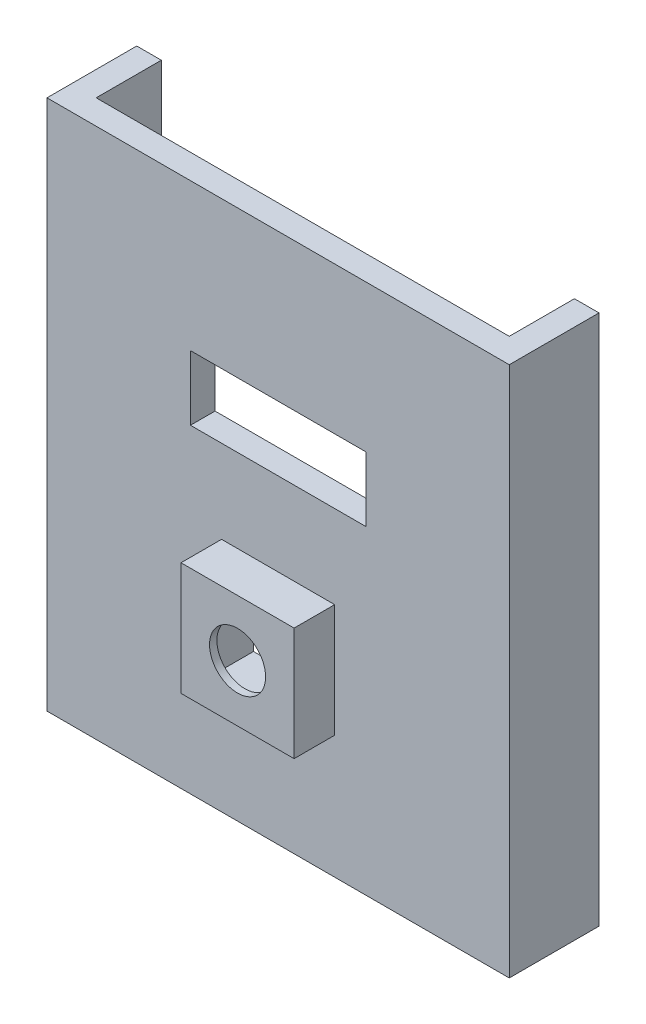
ISO-10303-21;
HEADER;
FILE_DESCRIPTION(('STEP AP214'),'2;1');
FILE_NAME('part.step','',(''),(''),'','','');
FILE_SCHEMA(('AUTOMOTIVE_DESIGN { 1 0 10303 214 1 1 1 1 }'));
ENDSEC;
DATA;
#1=APPLICATION_CONTEXT('core data for automotive mechanical design processes');
#2=APPLICATION_PROTOCOL_DEFINITION('international standard','automotive_design',2000,#1);
#3=PRODUCT_CONTEXT('',#1,'mechanical');
#4=PRODUCT('Part','Part','',(#3));
#5=PRODUCT_RELATED_PRODUCT_CATEGORY('part','',(#4));
#6=PRODUCT_DEFINITION_FORMATION('','',#4);
#7=PRODUCT_DEFINITION_CONTEXT('part definition',#1,'design');
#8=PRODUCT_DEFINITION('design','',#6,#7);
#9=PRODUCT_DEFINITION_SHAPE('','',#8);
#10=(LENGTH_UNIT() NAMED_UNIT(*) SI_UNIT(.MILLI.,.METRE.));
#11=(NAMED_UNIT(*) PLANE_ANGLE_UNIT() SI_UNIT($,.RADIAN.));
#12=(NAMED_UNIT(*) SI_UNIT($,.STERADIAN.) SOLID_ANGLE_UNIT());
#13=UNCERTAINTY_MEASURE_WITH_UNIT(LENGTH_MEASURE(1.E-05),#10,'distance_accuracy_value','');
#14=(GEOMETRIC_REPRESENTATION_CONTEXT(3) GLOBAL_UNCERTAINTY_ASSIGNED_CONTEXT((#13)) GLOBAL_UNIT_ASSIGNED_CONTEXT((#10,
#11,#12)) REPRESENTATION_CONTEXT('',''));
#15=CARTESIAN_POINT('',(0.,0.,0.));
#16=DIRECTION('',(0.,0.,1.));
#17=DIRECTION('',(1.,0.,0.));
#18=AXIS2_PLACEMENT_3D('',#15,#16,#17);
#19=CARTESIAN_POINT('',(-93.9999999999997,-103.,103.));
#20=DIRECTION('',(1.,0.,0.));
#21=DIRECTION('',(0.,0.,-1.));
#22=AXIS2_PLACEMENT_3D('',#19,#20,#21);
#23=PLANE('',#22);
#24=DIRECTION('',(0.,1.,0.));
#25=VECTOR('',#24,1.);
#26=CARTESIAN_POINT('',(-93.9999999999997,0.,86.5));
#27=LINE('',#26,#25);
#28=CARTESIAN_POINT('',(-93.9999999999997,-72.9999999999995,86.5));
#29=VERTEX_POINT('',#28);
#30=CARTESIAN_POINT('',(-93.9999999999997,-52.9999999999995,86.5));
#31=VERTEX_POINT('',#30);
#32=EDGE_CURVE('E57',#29,#31,#27,.T.);
#33=ORIENTED_EDGE('',*,*,#32,.F.);
#34=DIRECTION('',(0.,0.,-1.));
#35=VECTOR('',#34,1.);
#36=CARTESIAN_POINT('',(-93.9999999999997,-72.9999999999995,0.));
#37=LINE('',#36,#35);
#38=CARTESIAN_POINT('',(-93.9999999999997,-72.9999999999995,76.5));
#39=VERTEX_POINT('',#38);
#40=EDGE_CURVE('E243',#29,#39,#37,.T.);
#41=ORIENTED_EDGE('',*,*,#40,.T.);
#42=DIRECTION('',(0.,1.,0.));
#43=VECTOR('',#42,1.);
#44=CARTESIAN_POINT('',(-93.9999999999997,-103.,76.5));
#45=LINE('',#44,#43);
#46=CARTESIAN_POINT('',(-93.9999999999997,-113.,76.5));
#47=VERTEX_POINT('',#46);
#48=EDGE_CURVE('E420',#47,#39,#45,.T.);
#49=ORIENTED_EDGE('',*,*,#48,.F.);
#50=DIRECTION('',(0.,0.,-1.));
#51=VECTOR('',#50,1.);
#52=CARTESIAN_POINT('',(-93.9999999999997,-113.,103.));
#53=LINE('',#52,#51);
#54=CARTESIAN_POINT('',(-93.9999999999997,-113.,113.));
#55=VERTEX_POINT('',#54);
#56=EDGE_CURVE('E432',#55,#47,#53,.T.);
#57=ORIENTED_EDGE('',*,*,#56,.F.);
#58=DIRECTION('',(0.,-1.,0.));
#59=VECTOR('',#58,1.);
#60=CARTESIAN_POINT('',(-93.9999999999997,0.,113.));
#61=LINE('',#60,#59);
#62=CARTESIAN_POINT('',(-93.9999999999997,103.,113.));
#63=VERTEX_POINT('',#62);
#64=EDGE_CURVE('E292',#63,#55,#61,.T.);
#65=ORIENTED_EDGE('',*,*,#64,.F.);
#66=DIRECTION('',(0.,0.,-1.));
#67=VECTOR('',#66,1.);
#68=CARTESIAN_POINT('',(-93.9999999999997,103.,103.));
#69=LINE('',#68,#67);
#70=CARTESIAN_POINT('',(-93.9999999999997,103.,76.5));
#71=VERTEX_POINT('',#70);
#72=EDGE_CURVE('E429',#63,#71,#69,.T.);
#73=ORIENTED_EDGE('',*,*,#72,.T.);
#74=CARTESIAN_POINT('',(-93.9999999999997,63.0000000000004,76.5));
#75=VERTEX_POINT('',#74);
#76=EDGE_CURVE('E424',#75,#71,#45,.T.);
#77=ORIENTED_EDGE('',*,*,#76,.F.);
#78=DIRECTION('',(0.,0.,1.));
#79=VECTOR('',#78,1.);
#80=CARTESIAN_POINT('',(-93.9999999999997,63.0000000000004,0.));
#81=LINE('',#80,#79);
#82=CARTESIAN_POINT('',(-93.9999999999997,63.0000000000004,86.5));
#83=VERTEX_POINT('',#82);
#84=EDGE_CURVE('E256',#75,#83,#81,.T.);
#85=ORIENTED_EDGE('',*,*,#84,.T.);
#86=DIRECTION('',(0.,1.,0.));
#87=VECTOR('',#86,1.);
#88=CARTESIAN_POINT('',(-93.9999999999997,0.,86.5));
#89=LINE('',#88,#87);
#90=CARTESIAN_POINT('',(-93.9999999999997,43.0000000000004,86.5));
#91=VERTEX_POINT('',#90);
#92=EDGE_CURVE('E262',#91,#83,#89,.T.);
#93=ORIENTED_EDGE('',*,*,#92,.F.);
#94=DIRECTION('',(0.,0.,1.));
#95=VECTOR('',#94,1.);
#96=CARTESIAN_POINT('',(-93.9999999999997,43.0000000000004,0.));
#97=LINE('',#96,#95);
#98=CARTESIAN_POINT('',(-93.9999999999997,43.0000000000004,76.5));
#99=VERTEX_POINT('',#98);
#100=EDGE_CURVE('E269',#99,#91,#97,.T.);
#101=ORIENTED_EDGE('',*,*,#100,.F.);
#102=CARTESIAN_POINT('',(-93.9999999999997,-52.9999999999995,76.5));
#103=VERTEX_POINT('',#102);
#104=EDGE_CURVE('E63',#103,#99,#45,.T.);
#105=ORIENTED_EDGE('',*,*,#104,.F.);
#106=DIRECTION('',(0.,0.,-1.));
#107=VECTOR('',#106,1.);
#108=CARTESIAN_POINT('',(-93.9999999999997,-52.9999999999995,0.));
#109=LINE('',#108,#107);
#110=EDGE_CURVE('E482',#31,#103,#109,.T.);
#111=ORIENTED_EDGE('',*,*,#110,.F.);
#112=EDGE_LOOP('',(#33,#41,#49,#57,#65,#73,#77,#85,#93,#101,#105,#111));
#113=FACE_BOUND('',#112,.T.);
#114=ADVANCED_FACE('F40',(#113),#23,.F.);
#115=CARTESIAN_POINT('',(-93.9999999999997,103.,76.5));
#116=DIRECTION('',(0.,0.,-1.));
#117=DIRECTION('',(-1.,0.,0.));
#118=AXIS2_PLACEMENT_3D('',#115,#116,#117);
#119=PLANE('',#118);
#120=DIRECTION('',(0.,-1.,0.));
#121=VECTOR('',#120,1.);
#122=CARTESIAN_POINT('',(84.0000000000003,-103.,76.5));
#123=LINE('',#122,#121);
#124=CARTESIAN_POINT('',(84.0000000000003,103.,76.5));
#125=VERTEX_POINT('',#124);
#126=CARTESIAN_POINT('',(84.0000000000003,-103.,76.5));
#127=VERTEX_POINT('',#126);
#128=EDGE_CURVE('E408',#125,#127,#123,.T.);
#129=ORIENTED_EDGE('',*,*,#128,.F.);
#130=DIRECTION('',(1.,0.,0.));
#131=VECTOR('',#130,1.);
#132=CARTESIAN_POINT('',(-83.9999999999998,103.,76.5));
#133=LINE('',#132,#131);
#134=CARTESIAN_POINT('',(94.0000000000002,103.,76.5));
#135=VERTEX_POINT('',#134);
#136=EDGE_CURVE('E412',#125,#135,#133,.T.);
#137=ORIENTED_EDGE('',*,*,#136,.T.);
#138=DIRECTION('',(0.,-1.,0.));
#139=VECTOR('',#138,1.);
#140=CARTESIAN_POINT('',(94.0000000000003,-103.,76.5));
#141=LINE('',#140,#139);
#142=CARTESIAN_POINT('',(94.0000000000003,-113.,76.5));
#143=VERTEX_POINT('',#142);
#144=EDGE_CURVE('E416',#135,#143,#141,.T.);
#145=ORIENTED_EDGE('',*,*,#144,.T.);
#146=DIRECTION('',(-1.,0.,0.));
#147=VECTOR('',#146,1.);
#148=CARTESIAN_POINT('',(-83.9999999999998,-113.,76.5));
#149=LINE('',#148,#147);
#150=EDGE_CURVE('E283',#143,#47,#149,.T.);
#151=ORIENTED_EDGE('',*,*,#150,.T.);
#152=ORIENTED_EDGE('',*,*,#48,.T.);
#153=DIRECTION('',(-1.,0.,0.));
#154=VECTOR('',#153,1.);
#155=CARTESIAN_POINT('',(-114.,-72.9999999999995,76.5));
#156=LINE('',#155,#154);
#157=CARTESIAN_POINT('',(-114.,-72.9999999999995,76.5));
#158=VERTEX_POINT('',#157);
#159=EDGE_CURVE('E248',#39,#158,#156,.T.);
#160=ORIENTED_EDGE('',*,*,#159,.T.);
#161=DIRECTION('',(0.,1.,0.));
#162=VECTOR('',#161,1.);
#163=CARTESIAN_POINT('',(-114.,0.,76.5));
#164=LINE('',#163,#162);
#165=CARTESIAN_POINT('',(-114.,-52.9999999999995,76.5));
#166=VERTEX_POINT('',#165);
#167=EDGE_CURVE('E253',#158,#166,#164,.T.);
#168=ORIENTED_EDGE('',*,*,#167,.T.);
#169=DIRECTION('',(-1.,0.,0.));
#170=VECTOR('',#169,1.);
#171=CARTESIAN_POINT('',(-114.,-52.9999999999995,76.5));
#172=LINE('',#171,#170);
#173=EDGE_CURVE('E232',#103,#166,#172,.T.);
#174=ORIENTED_EDGE('',*,*,#173,.F.);
#175=ORIENTED_EDGE('',*,*,#104,.T.);
#176=DIRECTION('',(1.,0.,0.));
#177=VECTOR('',#176,1.);
#178=CARTESIAN_POINT('',(-114.,43.0000000000004,76.5));
#179=LINE('',#178,#177);
#180=CARTESIAN_POINT('',(-114.,43.0000000000004,76.5));
#181=VERTEX_POINT('',#180);
#182=EDGE_CURVE('E279',#181,#99,#179,.T.);
#183=ORIENTED_EDGE('',*,*,#182,.F.);
#184=DIRECTION('',(0.,1.,0.));
#185=VECTOR('',#184,1.);
#186=CARTESIAN_POINT('',(-114.,0.,76.5));
#187=LINE('',#186,#185);
#188=CARTESIAN_POINT('',(-114.,63.0000000000004,76.5));
#189=VERTEX_POINT('',#188);
#190=EDGE_CURVE('E280',#181,#189,#187,.T.);
#191=ORIENTED_EDGE('',*,*,#190,.T.);
#192=DIRECTION('',(1.,0.,0.));
#193=VECTOR('',#192,1.);
#194=CARTESIAN_POINT('',(-114.,63.0000000000004,76.5));
#195=LINE('',#194,#193);
#196=EDGE_CURVE('E284',#189,#75,#195,.T.);
#197=ORIENTED_EDGE('',*,*,#196,.T.);
#198=ORIENTED_EDGE('',*,*,#76,.T.);
#199=CARTESIAN_POINT('',(-83.9999999999998,103.,76.5));
#200=VERTEX_POINT('',#199);
#201=EDGE_CURVE('E411',#71,#200,#133,.T.);
#202=ORIENTED_EDGE('',*,*,#201,.T.);
#203=DIRECTION('',(0.,1.,0.));
#204=VECTOR('',#203,1.);
#205=CARTESIAN_POINT('',(-83.9999999999998,-103.,76.5));
#206=LINE('',#205,#204);
#207=CARTESIAN_POINT('',(-83.9999999999998,-103.,76.5));
#208=VERTEX_POINT('',#207);
#209=EDGE_CURVE('E406',#208,#200,#206,.T.);
#210=ORIENTED_EDGE('',*,*,#209,.F.);
#211=DIRECTION('',(-1.,0.,0.));
#212=VECTOR('',#211,1.);
#213=CARTESIAN_POINT('',(-83.9999999999998,-103.,76.5));
#214=LINE('',#213,#212);
#215=EDGE_CURVE('E403',#127,#208,#214,.T.);
#216=ORIENTED_EDGE('',*,*,#215,.F.);
#217=EDGE_LOOP('',(#129,#137,#145,#151,#152,#160,#168,#174,#175,#183,#191,#197,#198,#202,#210,#216));
#218=FACE_BOUND('',#217,.T.);
#219=ADVANCED_FACE('F464',(#218),#119,.T.);
#220=CARTESIAN_POINT('',(0.,-40.,106.5));
#221=DIRECTION('',(0.,0.,1.));
#222=DIRECTION('',(1.,0.,0.));
#223=AXIS2_PLACEMENT_3D('',#220,#221,#222);
#224=CYLINDRICAL_SURFACE('',#223,11.4);
#225=CARTESIAN_POINT('',(0.,-40.,126.5));
#226=DIRECTION('',(0.,0.,-1.));
#227=DIRECTION('',(-1.,0.,0.));
#228=AXIS2_PLACEMENT_3D('',#225,#226,#227);
#229=CIRCLE('',#228,11.4);
#230=CARTESIAN_POINT('',(-11.4,-40.,126.5));
#231=VERTEX_POINT('',#230);
#232=EDGE_CURVE('E389',#231,#231,#229,.T.);
#233=ORIENTED_EDGE('',*,*,#232,.T.);
#234=EDGE_LOOP('',(#233));
#235=FACE_BOUND('',#234,.T.);
#236=CARTESIAN_POINT('',(0.,-40.,129.5));
#237=DIRECTION('',(0.,0.,1.));
#238=DIRECTION('',(1.,0.,0.));
#239=AXIS2_PLACEMENT_3D('',#236,#237,#238);
#240=CIRCLE('',#239,11.4);
#241=CARTESIAN_POINT('',(11.4,-40.,129.5));
#242=VERTEX_POINT('',#241);
#243=EDGE_CURVE('E392',#242,#242,#240,.T.);
#244=ORIENTED_EDGE('',*,*,#243,.T.);
#245=EDGE_LOOP('',(#244));
#246=FACE_BOUND('',#245,.T.);
#247=ADVANCED_FACE('F485',(#235,#246),#224,.F.);
#248=CARTESIAN_POINT('',(0.,0.,129.5));
#249=DIRECTION('',(0.,0.,-1.));
#250=DIRECTION('',(-1.,0.,0.));
#251=AXIS2_PLACEMENT_3D('',#248,#249,#250);
#252=PLANE('',#251);
#253=ORIENTED_EDGE('',*,*,#243,.F.);
#254=EDGE_LOOP('',(#253));
#255=FACE_BOUND('',#254,.T.);
#256=DIRECTION('',(0.,1.,0.));
#257=VECTOR('',#256,1.);
#258=CARTESIAN_POINT('',(-23.,0.,129.5));
#259=LINE('',#258,#257);
#260=CARTESIAN_POINT('',(-23.,-63.,129.5));
#261=VERTEX_POINT('',#260);
#262=CARTESIAN_POINT('',(-23.,-17.,129.5));
#263=VERTEX_POINT('',#262);
#264=EDGE_CURVE('E355',#261,#263,#259,.T.);
#265=ORIENTED_EDGE('',*,*,#264,.F.);
#266=DIRECTION('',(1.,0.,0.));
#267=VECTOR('',#266,1.);
#268=CARTESIAN_POINT('',(0.,-63.,129.5));
#269=LINE('',#268,#267);
#270=CARTESIAN_POINT('',(23.,-63.,129.5));
#271=VERTEX_POINT('',#270);
#272=EDGE_CURVE('E344',#261,#271,#269,.T.);
#273=ORIENTED_EDGE('',*,*,#272,.T.);
#274=DIRECTION('',(0.,1.,0.));
#275=VECTOR('',#274,1.);
#276=CARTESIAN_POINT('',(23.,0.,129.5));
#277=LINE('',#276,#275);
#278=CARTESIAN_POINT('',(23.,-17.,129.5));
#279=VERTEX_POINT('',#278);
#280=EDGE_CURVE('E365',#271,#279,#277,.T.);
#281=ORIENTED_EDGE('',*,*,#280,.T.);
#282=DIRECTION('',(1.,0.,0.));
#283=VECTOR('',#282,1.);
#284=CARTESIAN_POINT('',(0.,-17.,129.5));
#285=LINE('',#284,#283);
#286=EDGE_CURVE('E367',#263,#279,#285,.T.);
#287=ORIENTED_EDGE('',*,*,#286,.F.);
#288=EDGE_LOOP('',(#265,#273,#281,#287));
#289=FACE_BOUND('',#288,.T.);
#290=ADVANCED_FACE('F494',(#255,#289),#252,.F.);
#291=CARTESIAN_POINT('',(0.,0.,126.5));
#292=DIRECTION('',(0.,0.,-1.));
#293=DIRECTION('',(-1.,0.,0.));
#294=AXIS2_PLACEMENT_3D('',#291,#292,#293);
#295=PLANE('',#294);
#296=ORIENTED_EDGE('',*,*,#232,.F.);
#297=EDGE_LOOP('',(#296));
#298=FACE_BOUND('',#297,.T.);
#299=DIRECTION('',(0.,1.,0.));
#300=VECTOR('',#299,1.);
#301=CARTESIAN_POINT('',(-20.,-60.,126.5));
#302=LINE('',#301,#300);
#303=CARTESIAN_POINT('',(-20.,-60.,126.5));
#304=VERTEX_POINT('',#303);
#305=CARTESIAN_POINT('',(-20.,-20.,126.5));
#306=VERTEX_POINT('',#305);
#307=EDGE_CURVE('E386',#304,#306,#302,.T.);
#308=ORIENTED_EDGE('',*,*,#307,.T.);
#309=DIRECTION('',(1.,0.,0.));
#310=VECTOR('',#309,1.);
#311=CARTESIAN_POINT('',(-20.,-20.,126.5));
#312=LINE('',#311,#310);
#313=CARTESIAN_POINT('',(20.,-20.,126.5));
#314=VERTEX_POINT('',#313);
#315=EDGE_CURVE('E383',#306,#314,#312,.T.);
#316=ORIENTED_EDGE('',*,*,#315,.T.);
#317=DIRECTION('',(0.,1.,0.));
#318=VECTOR('',#317,1.);
#319=CARTESIAN_POINT('',(20.,-60.,126.5));
#320=LINE('',#319,#318);
#321=CARTESIAN_POINT('',(20.,-60.,126.5));
#322=VERTEX_POINT('',#321);
#323=EDGE_CURVE('E381',#322,#314,#320,.T.);
#324=ORIENTED_EDGE('',*,*,#323,.F.);
#325=DIRECTION('',(1.,0.,0.));
#326=VECTOR('',#325,1.);
#327=CARTESIAN_POINT('',(-20.,-60.,126.5));
#328=LINE('',#327,#326);
#329=EDGE_CURVE('E374',#304,#322,#328,.T.);
#330=ORIENTED_EDGE('',*,*,#329,.F.);
#331=EDGE_LOOP('',(#308,#316,#324,#330));
#332=FACE_BOUND('',#331,.T.);
#333=ADVANCED_FACE('F500',(#298,#332),#295,.T.);
#334=CARTESIAN_POINT('',(23.,0.,129.5));
#335=DIRECTION('',(-1.,0.,0.));
#336=DIRECTION('',(0.,0.,1.));
#337=AXIS2_PLACEMENT_3D('',#334,#335,#336);
#338=PLANE('',#337);
#339=DIRECTION('',(0.,1.,0.));
#340=VECTOR('',#339,1.);
#341=CARTESIAN_POINT('',(23.,0.,113.));
#342=LINE('',#341,#340);
#343=CARTESIAN_POINT('',(23.,-63.,113.));
#344=VERTEX_POINT('',#343);
#345=CARTESIAN_POINT('',(23.,-17.,113.));
#346=VERTEX_POINT('',#345);
#347=EDGE_CURVE('E354',#344,#346,#342,.T.);
#348=ORIENTED_EDGE('',*,*,#347,.T.);
#349=DIRECTION('',(0.,0.,-1.));
#350=VECTOR('',#349,1.);
#351=CARTESIAN_POINT('',(23.,-17.,129.5));
#352=LINE('',#351,#350);
#353=EDGE_CURVE('E345',#279,#346,#352,.T.);
#354=ORIENTED_EDGE('',*,*,#353,.F.);
#355=ORIENTED_EDGE('',*,*,#280,.F.);
#356=DIRECTION('',(0.,0.,-1.));
#357=VECTOR('',#356,1.);
#358=CARTESIAN_POINT('',(23.,-63.,129.5));
#359=LINE('',#358,#357);
#360=EDGE_CURVE('E348',#271,#344,#359,.T.);
#361=ORIENTED_EDGE('',*,*,#360,.T.);
#362=EDGE_LOOP('',(#348,#354,#355,#361));
#363=FACE_BOUND('',#362,.T.);
#364=ADVANCED_FACE('F555',(#363),#338,.F.);
#365=CARTESIAN_POINT('',(0.,-17.,129.5));
#366=DIRECTION('',(0.,1.,0.));
#367=DIRECTION('',(0.,0.,1.));
#368=AXIS2_PLACEMENT_3D('',#365,#366,#367);
#369=PLANE('',#368);
#370=DIRECTION('',(1.,0.,0.));
#371=VECTOR('',#370,1.);
#372=CARTESIAN_POINT('',(0.,-17.,113.));
#373=LINE('',#372,#371);
#374=CARTESIAN_POINT('',(-23.,-17.,113.));
#375=VERTEX_POINT('',#374);
#376=EDGE_CURVE('E357',#375,#346,#373,.T.);
#377=ORIENTED_EDGE('',*,*,#376,.F.);
#378=DIRECTION('',(0.,0.,-1.));
#379=VECTOR('',#378,1.);
#380=CARTESIAN_POINT('',(-23.,-17.,129.5));
#381=LINE('',#380,#379);
#382=EDGE_CURVE('E342',#263,#375,#381,.T.);
#383=ORIENTED_EDGE('',*,*,#382,.F.);
#384=ORIENTED_EDGE('',*,*,#286,.T.);
#385=ORIENTED_EDGE('',*,*,#353,.T.);
#386=EDGE_LOOP('',(#377,#383,#384,#385));
#387=FACE_BOUND('',#386,.T.);
#388=ADVANCED_FACE('F551',(#387),#369,.T.);
#389=CARTESIAN_POINT('',(-23.,0.,129.5));
#390=DIRECTION('',(-1.,0.,0.));
#391=DIRECTION('',(0.,0.,1.));
#392=AXIS2_PLACEMENT_3D('',#389,#390,#391);
#393=PLANE('',#392);
#394=DIRECTION('',(0.,1.,0.));
#395=VECTOR('',#394,1.);
#396=CARTESIAN_POINT('',(-23.,0.,113.));
#397=LINE('',#396,#395);
#398=CARTESIAN_POINT('',(-23.,-63.,113.));
#399=VERTEX_POINT('',#398);
#400=EDGE_CURVE('E360',#399,#375,#397,.T.);
#401=ORIENTED_EDGE('',*,*,#400,.F.);
#402=DIRECTION('',(0.,0.,-1.));
#403=VECTOR('',#402,1.);
#404=CARTESIAN_POINT('',(-23.,-63.,129.5));
#405=LINE('',#404,#403);
#406=EDGE_CURVE('E330',#261,#399,#405,.T.);
#407=ORIENTED_EDGE('',*,*,#406,.F.);
#408=ORIENTED_EDGE('',*,*,#264,.T.);
#409=ORIENTED_EDGE('',*,*,#382,.T.);
#410=EDGE_LOOP('',(#401,#407,#408,#409));
#411=FACE_BOUND('',#410,.T.);
#412=ADVANCED_FACE('F547',(#411),#393,.T.);
#413=CARTESIAN_POINT('',(0.,-63.,129.5));
#414=DIRECTION('',(0.,1.,0.));
#415=DIRECTION('',(0.,0.,1.));
#416=AXIS2_PLACEMENT_3D('',#413,#414,#415);
#417=PLANE('',#416);
#418=DIRECTION('',(1.,0.,0.));
#419=VECTOR('',#418,1.);
#420=CARTESIAN_POINT('',(0.,-63.,113.));
#421=LINE('',#420,#419);
#422=EDGE_CURVE('E352',#399,#344,#421,.T.);
#423=ORIENTED_EDGE('',*,*,#422,.T.);
#424=ORIENTED_EDGE('',*,*,#360,.F.);
#425=ORIENTED_EDGE('',*,*,#272,.F.);
#426=ORIENTED_EDGE('',*,*,#406,.T.);
#427=EDGE_LOOP('',(#423,#424,#425,#426));
#428=FACE_BOUND('',#427,.T.);
#429=ADVANCED_FACE('F550',(#428),#417,.F.);
#430=CARTESIAN_POINT('',(-20.,-20.,126.5));
#431=DIRECTION('',(0.,1.,0.));
#432=DIRECTION('',(0.,0.,1.));
#433=AXIS2_PLACEMENT_3D('',#430,#431,#432);
#434=PLANE('',#433);
#435=DIRECTION('',(0.,0.,-1.));
#436=VECTOR('',#435,1.);
#437=CARTESIAN_POINT('',(-20.,-20.,126.5));
#438=LINE('',#437,#436);
#439=CARTESIAN_POINT('',(-20.,-20.,103.));
#440=VERTEX_POINT('',#439);
#441=EDGE_CURVE('E372',#306,#440,#438,.T.);
#442=ORIENTED_EDGE('',*,*,#441,.T.);
#443=DIRECTION('',(-1.,0.,0.));
#444=VECTOR('',#443,1.);
#445=CARTESIAN_POINT('',(-20.,-20.,103.));
#446=LINE('',#445,#444);
#447=CARTESIAN_POINT('',(20.,-20.,103.));
#448=VERTEX_POINT('',#447);
#449=EDGE_CURVE('E11',#448,#440,#446,.T.);
#450=ORIENTED_EDGE('',*,*,#449,.F.);
#451=DIRECTION('',(0.,0.,-1.));
#452=VECTOR('',#451,1.);
#453=CARTESIAN_POINT('',(20.,-20.,126.5));
#454=LINE('',#453,#452);
#455=EDGE_CURVE('E375',#314,#448,#454,.T.);
#456=ORIENTED_EDGE('',*,*,#455,.F.);
#457=ORIENTED_EDGE('',*,*,#315,.F.);
#458=EDGE_LOOP('',(#442,#450,#456,#457));
#459=FACE_BOUND('',#458,.T.);
#460=ADVANCED_FACE('F561',(#459),#434,.F.);
#461=CARTESIAN_POINT('',(20.,-60.,126.5));
#462=DIRECTION('',(-1.,0.,0.));
#463=DIRECTION('',(0.,0.,1.));
#464=AXIS2_PLACEMENT_3D('',#461,#462,#463);
#465=PLANE('',#464);
#466=ORIENTED_EDGE('',*,*,#455,.T.);
#467=DIRECTION('',(0.,1.,0.));
#468=VECTOR('',#467,1.);
#469=CARTESIAN_POINT('',(20.,-60.,103.));
#470=LINE('',#469,#468);
#471=CARTESIAN_POINT('',(20.,-60.,103.));
#472=VERTEX_POINT('',#471);
#473=EDGE_CURVE('E395',#472,#448,#470,.T.);
#474=ORIENTED_EDGE('',*,*,#473,.F.);
#475=DIRECTION('',(0.,0.,-1.));
#476=VECTOR('',#475,1.);
#477=CARTESIAN_POINT('',(20.,-60.,126.5));
#478=LINE('',#477,#476);
#479=EDGE_CURVE('E377',#322,#472,#478,.T.);
#480=ORIENTED_EDGE('',*,*,#479,.F.);
#481=ORIENTED_EDGE('',*,*,#323,.T.);
#482=EDGE_LOOP('',(#466,#474,#480,#481));
#483=FACE_BOUND('',#482,.T.);
#484=ADVANCED_FACE('F570',(#483),#465,.T.);
#485=CARTESIAN_POINT('',(-20.,-60.,126.5));
#486=DIRECTION('',(0.,1.,0.));
#487=DIRECTION('',(0.,0.,1.));
#488=AXIS2_PLACEMENT_3D('',#485,#486,#487);
#489=PLANE('',#488);
#490=ORIENTED_EDGE('',*,*,#479,.T.);
#491=DIRECTION('',(1.,0.,0.));
#492=VECTOR('',#491,1.);
#493=CARTESIAN_POINT('',(-20.,-60.,103.));
#494=LINE('',#493,#492);
#495=CARTESIAN_POINT('',(-20.,-60.,103.));
#496=VERTEX_POINT('',#495);
#497=EDGE_CURVE('E398',#496,#472,#494,.T.);
#498=ORIENTED_EDGE('',*,*,#497,.F.);
#499=DIRECTION('',(0.,0.,-1.));
#500=VECTOR('',#499,1.);
#501=CARTESIAN_POINT('',(-20.,-60.,126.5));
#502=LINE('',#501,#500);
#503=EDGE_CURVE('E363',#304,#496,#502,.T.);
#504=ORIENTED_EDGE('',*,*,#503,.F.);
#505=ORIENTED_EDGE('',*,*,#329,.T.);
#506=EDGE_LOOP('',(#490,#498,#504,#505));
#507=FACE_BOUND('',#506,.T.);
#508=ADVANCED_FACE('F566',(#507),#489,.T.);
#509=CARTESIAN_POINT('',(-20.,-60.,126.5));
#510=DIRECTION('',(-1.,0.,0.));
#511=DIRECTION('',(0.,0.,1.));
#512=AXIS2_PLACEMENT_3D('',#509,#510,#511);
#513=PLANE('',#512);
#514=ORIENTED_EDGE('',*,*,#503,.T.);
#515=DIRECTION('',(0.,-1.,0.));
#516=VECTOR('',#515,1.);
#517=CARTESIAN_POINT('',(-20.,-60.,103.));
#518=LINE('',#517,#516);
#519=EDGE_CURVE('E49',#440,#496,#518,.T.);
#520=ORIENTED_EDGE('',*,*,#519,.F.);
#521=ORIENTED_EDGE('',*,*,#441,.F.);
#522=ORIENTED_EDGE('',*,*,#307,.F.);
#523=EDGE_LOOP('',(#514,#520,#521,#522));
#524=FACE_BOUND('',#523,.T.);
#525=ADVANCED_FACE('F539',(#524),#513,.F.);
#526=CARTESIAN_POINT('',(-35.65,16.85,-10.001));
#527=DIRECTION('',(0.,-1.,0.));
#528=DIRECTION('',(0.,0.,-1.));
#529=AXIS2_PLACEMENT_3D('',#526,#527,#528);
#530=PLANE('',#529);
#531=DIRECTION('',(0.,0.,1.));
#532=VECTOR('',#531,1.);
#533=CARTESIAN_POINT('',(-35.65,16.85,-10.001));
#534=LINE('',#533,#532);
#535=CARTESIAN_POINT('',(-35.65,16.85,103.));
#536=VERTEX_POINT('',#535);
#537=CARTESIAN_POINT('',(-35.65,16.85,113.));
#538=VERTEX_POINT('',#537);
#539=EDGE_CURVE('E319',#536,#538,#534,.T.);
#540=ORIENTED_EDGE('',*,*,#539,.T.);
#541=DIRECTION('',(1.,0.,0.));
#542=VECTOR('',#541,1.);
#543=CARTESIAN_POINT('',(-35.65,16.85,113.));
#544=LINE('',#543,#542);
#545=CARTESIAN_POINT('',(35.65,16.85,113.));
#546=VERTEX_POINT('',#545);
#547=EDGE_CURVE('E309',#538,#546,#544,.T.);
#548=ORIENTED_EDGE('',*,*,#547,.T.);
#549=DIRECTION('',(0.,0.,1.));
#550=VECTOR('',#549,1.);
#551=CARTESIAN_POINT('',(35.65,16.85,-10.001));
#552=LINE('',#551,#550);
#553=CARTESIAN_POINT('',(35.65,16.85,103.));
#554=VERTEX_POINT('',#553);
#555=EDGE_CURVE('E322',#554,#546,#552,.T.);
#556=ORIENTED_EDGE('',*,*,#555,.F.);
#557=DIRECTION('',(1.,0.,0.));
#558=VECTOR('',#557,1.);
#559=CARTESIAN_POINT('',(-35.65,16.85,103.));
#560=LINE('',#559,#558);
#561=EDGE_CURVE('E314',#536,#554,#560,.T.);
#562=ORIENTED_EDGE('',*,*,#561,.F.);
#563=EDGE_LOOP('',(#540,#548,#556,#562));
#564=FACE_BOUND('',#563,.T.);
#565=ADVANCED_FACE('F535',(#564),#530,.F.);
#566=CARTESIAN_POINT('',(-35.65,16.85,-10.001));
#567=DIRECTION('',(-1.,0.,0.));
#568=DIRECTION('',(0.,0.,1.));
#569=AXIS2_PLACEMENT_3D('',#566,#567,#568);
#570=PLANE('',#569);
#571=DIRECTION('',(0.,0.,1.));
#572=VECTOR('',#571,1.);
#573=CARTESIAN_POINT('',(-35.65,43.15,-10.001));
#574=LINE('',#573,#572);
#575=CARTESIAN_POINT('',(-35.65,43.15,103.));
#576=VERTEX_POINT('',#575);
#577=CARTESIAN_POINT('',(-35.65,43.15,113.));
#578=VERTEX_POINT('',#577);
#579=EDGE_CURVE('E315',#576,#578,#574,.T.);
#580=ORIENTED_EDGE('',*,*,#579,.T.);
#581=DIRECTION('',(0.,-1.,0.));
#582=VECTOR('',#581,1.);
#583=CARTESIAN_POINT('',(-35.65,16.85,113.));
#584=LINE('',#583,#582);
#585=EDGE_CURVE('E335',#578,#538,#584,.T.);
#586=ORIENTED_EDGE('',*,*,#585,.T.);
#587=ORIENTED_EDGE('',*,*,#539,.F.);
#588=DIRECTION('',(0.,-1.,0.));
#589=VECTOR('',#588,1.);
#590=CARTESIAN_POINT('',(-35.65,16.85,103.));
#591=LINE('',#590,#589);
#592=EDGE_CURVE('E321',#576,#536,#591,.T.);
#593=ORIENTED_EDGE('',*,*,#592,.F.);
#594=EDGE_LOOP('',(#580,#586,#587,#593));
#595=FACE_BOUND('',#594,.T.);
#596=ADVANCED_FACE('F538',(#595),#570,.F.);
#597=CARTESIAN_POINT('',(-35.65,43.15,-10.001));
#598=DIRECTION('',(0.,1.,0.));
#599=DIRECTION('',(0.,0.,1.));
#600=AXIS2_PLACEMENT_3D('',#597,#598,#599);
#601=PLANE('',#600);
#602=DIRECTION('',(0.,0.,1.));
#603=VECTOR('',#602,1.);
#604=CARTESIAN_POINT('',(35.65,43.15,-10.001));
#605=LINE('',#604,#603);
#606=CARTESIAN_POINT('',(35.65,43.15,103.));
#607=VERTEX_POINT('',#606);
#608=CARTESIAN_POINT('',(35.65,43.15,113.));
#609=VERTEX_POINT('',#608);
#610=EDGE_CURVE('E310',#607,#609,#605,.T.);
#611=ORIENTED_EDGE('',*,*,#610,.T.);
#612=DIRECTION('',(-1.,0.,0.));
#613=VECTOR('',#612,1.);
#614=CARTESIAN_POINT('',(-35.65,43.15,113.));
#615=LINE('',#614,#613);
#616=EDGE_CURVE('E332',#609,#578,#615,.T.);
#617=ORIENTED_EDGE('',*,*,#616,.T.);
#618=ORIENTED_EDGE('',*,*,#579,.F.);
#619=DIRECTION('',(-1.,0.,0.));
#620=VECTOR('',#619,1.);
#621=CARTESIAN_POINT('',(-35.65,43.15,103.));
#622=LINE('',#621,#620);
#623=EDGE_CURVE('E317',#607,#576,#622,.T.);
#624=ORIENTED_EDGE('',*,*,#623,.F.);
#625=EDGE_LOOP('',(#611,#617,#618,#624));
#626=FACE_BOUND('',#625,.T.);
#627=ADVANCED_FACE('F533',(#626),#601,.F.);
#628=CARTESIAN_POINT('',(35.65,16.85,-10.001));
#629=DIRECTION('',(1.,0.,0.));
#630=DIRECTION('',(0.,0.,-1.));
#631=AXIS2_PLACEMENT_3D('',#628,#629,#630);
#632=PLANE('',#631);
#633=ORIENTED_EDGE('',*,*,#555,.T.);
#634=DIRECTION('',(0.,1.,0.));
#635=VECTOR('',#634,1.);
#636=CARTESIAN_POINT('',(35.65,16.85,113.));
#637=LINE('',#636,#635);
#638=EDGE_CURVE('E318',#546,#609,#637,.T.);
#639=ORIENTED_EDGE('',*,*,#638,.T.);
#640=ORIENTED_EDGE('',*,*,#610,.F.);
#641=DIRECTION('',(0.,1.,0.));
#642=VECTOR('',#641,1.);
#643=CARTESIAN_POINT('',(35.65,16.85,103.));
#644=LINE('',#643,#642);
#645=EDGE_CURVE('E313',#554,#607,#644,.T.);
#646=ORIENTED_EDGE('',*,*,#645,.F.);
#647=EDGE_LOOP('',(#633,#639,#640,#646));
#648=FACE_BOUND('',#647,.T.);
#649=ADVANCED_FACE('F508',(#648),#632,.F.);
#650=CARTESIAN_POINT('',(-83.9999999999998,103.,103.));
#651=DIRECTION('',(0.,-1.,0.));
#652=DIRECTION('',(0.,0.,-1.));
#653=AXIS2_PLACEMENT_3D('',#650,#651,#652);
#654=PLANE('',#653);
#655=ORIENTED_EDGE('',*,*,#201,.F.);
#656=ORIENTED_EDGE('',*,*,#72,.F.);
#657=DIRECTION('',(-1.,0.,0.));
#658=VECTOR('',#657,1.);
#659=CARTESIAN_POINT('',(0.,103.,113.));
#660=LINE('',#659,#658);
#661=CARTESIAN_POINT('',(94.0000000000003,103.,113.));
#662=VERTEX_POINT('',#661);
#663=EDGE_CURVE('E289',#662,#63,#660,.T.);
#664=ORIENTED_EDGE('',*,*,#663,.F.);
#665=DIRECTION('',(0.,0.,-1.));
#666=VECTOR('',#665,1.);
#667=CARTESIAN_POINT('',(94.0000000000002,103.,103.));
#668=LINE('',#667,#666);
#669=EDGE_CURVE('E405',#662,#135,#668,.T.);
#670=ORIENTED_EDGE('',*,*,#669,.T.);
#671=ORIENTED_EDGE('',*,*,#136,.F.);
#672=DIRECTION('',(0.,0.,-1.));
#673=VECTOR('',#672,1.);
#674=CARTESIAN_POINT('',(84.0000000000003,103.,103.));
#675=LINE('',#674,#673);
#676=CARTESIAN_POINT('',(84.0000000000003,103.,103.));
#677=VERTEX_POINT('',#676);
#678=EDGE_CURVE('E299',#677,#125,#675,.T.);
#679=ORIENTED_EDGE('',*,*,#678,.F.);
#680=DIRECTION('',(-1.,0.,0.));
#681=VECTOR('',#680,1.);
#682=CARTESIAN_POINT('',(-83.9999999999998,103.,103.));
#683=LINE('',#682,#681);
#684=CARTESIAN_POINT('',(-83.9999999999998,103.,103.));
#685=VERTEX_POINT('',#684);
#686=EDGE_CURVE('E304',#677,#685,#683,.T.);
#687=ORIENTED_EDGE('',*,*,#686,.T.);
#688=DIRECTION('',(0.,0.,-1.));
#689=VECTOR('',#688,1.);
#690=CARTESIAN_POINT('',(-83.9999999999998,103.,103.));
#691=LINE('',#690,#689);
#692=EDGE_CURVE('E437',#685,#200,#691,.T.);
#693=ORIENTED_EDGE('',*,*,#692,.T.);
#694=EDGE_LOOP('',(#655,#656,#664,#670,#671,#679,#687,#693));
#695=FACE_BOUND('',#694,.T.);
#696=ADVANCED_FACE('F460',(#695),#654,.F.);
#697=CARTESIAN_POINT('',(0.,0.,103.));
#698=DIRECTION('',(0.,0.,-1.));
#699=DIRECTION('',(-1.,0.,0.));
#700=AXIS2_PLACEMENT_3D('',#697,#698,#699);
#701=PLANE('',#700);
#702=ORIENTED_EDGE('',*,*,#645,.T.);
#703=ORIENTED_EDGE('',*,*,#623,.T.);
#704=ORIENTED_EDGE('',*,*,#592,.T.);
#705=ORIENTED_EDGE('',*,*,#561,.T.);
#706=EDGE_LOOP('',(#702,#703,#704,#705));
#707=FACE_BOUND('',#706,.T.);
#708=DIRECTION('',(0.,1.,0.));
#709=VECTOR('',#708,1.);
#710=CARTESIAN_POINT('',(84.0000000000003,-103.,103.));
#711=LINE('',#710,#709);
#712=CARTESIAN_POINT('',(84.0000000000003,-103.,103.));
#713=VERTEX_POINT('',#712);
#714=EDGE_CURVE('E307',#713,#677,#711,.T.);
#715=ORIENTED_EDGE('',*,*,#714,.F.);
#716=DIRECTION('',(1.,0.,0.));
#717=VECTOR('',#716,1.);
#718=CARTESIAN_POINT('',(-83.9999999999998,-103.,103.));
#719=LINE('',#718,#717);
#720=CARTESIAN_POINT('',(-83.9999999999998,-103.,103.));
#721=VERTEX_POINT('',#720);
#722=EDGE_CURVE('E300',#721,#713,#719,.T.);
#723=ORIENTED_EDGE('',*,*,#722,.F.);
#724=DIRECTION('',(0.,-1.,0.));
#725=VECTOR('',#724,1.);
#726=CARTESIAN_POINT('',(-83.9999999999998,-103.,103.));
#727=LINE('',#726,#725);
#728=EDGE_CURVE('E302',#685,#721,#727,.T.);
#729=ORIENTED_EDGE('',*,*,#728,.F.);
#730=ORIENTED_EDGE('',*,*,#686,.F.);
#731=EDGE_LOOP('',(#715,#723,#729,#730));
#732=FACE_BOUND('',#731,.T.);
#733=ORIENTED_EDGE('',*,*,#519,.T.);
#734=ORIENTED_EDGE('',*,*,#497,.T.);
#735=ORIENTED_EDGE('',*,*,#473,.T.);
#736=ORIENTED_EDGE('',*,*,#449,.T.);
#737=EDGE_LOOP('',(#733,#734,#735,#736));
#738=FACE_BOUND('',#737,.T.);
#739=ADVANCED_FACE('F453',(#707,#732,#738),#701,.T.);
#740=CARTESIAN_POINT('',(-83.9999999999998,-103.,103.));
#741=DIRECTION('',(1.,0.,0.));
#742=DIRECTION('',(0.,0.,-1.));
#743=AXIS2_PLACEMENT_3D('',#740,#741,#742);
#744=PLANE('',#743);
#745=DIRECTION('',(0.,0.,-1.));
#746=VECTOR('',#745,1.);
#747=CARTESIAN_POINT('',(-83.9999999999998,-103.,103.));
#748=LINE('',#747,#746);
#749=EDGE_CURVE('E439',#721,#208,#748,.T.);
#750=ORIENTED_EDGE('',*,*,#749,.T.);
#751=ORIENTED_EDGE('',*,*,#209,.T.);
#752=ORIENTED_EDGE('',*,*,#692,.F.);
#753=ORIENTED_EDGE('',*,*,#728,.T.);
#754=EDGE_LOOP('',(#750,#751,#752,#753));
#755=FACE_BOUND('',#754,.T.);
#756=ADVANCED_FACE('F529',(#755),#744,.T.);
#757=CARTESIAN_POINT('',(84.0000000000003,-103.,103.));
#758=DIRECTION('',(-1.,0.,0.));
#759=DIRECTION('',(0.,0.,1.));
#760=AXIS2_PLACEMENT_3D('',#757,#758,#759);
#761=PLANE('',#760);
#762=ORIENTED_EDGE('',*,*,#678,.T.);
#763=ORIENTED_EDGE('',*,*,#128,.T.);
#764=DIRECTION('',(0.,0.,-1.));
#765=VECTOR('',#764,1.);
#766=CARTESIAN_POINT('',(84.0000000000003,-103.,103.));
#767=LINE('',#766,#765);
#768=EDGE_CURVE('E44',#713,#127,#767,.T.);
#769=ORIENTED_EDGE('',*,*,#768,.F.);
#770=ORIENTED_EDGE('',*,*,#714,.T.);
#771=EDGE_LOOP('',(#762,#763,#769,#770));
#772=FACE_BOUND('',#771,.T.);
#773=ADVANCED_FACE('F450',(#772),#761,.T.);
#774=CARTESIAN_POINT('',(-83.9999999999998,-103.,103.));
#775=DIRECTION('',(0.,1.,0.));
#776=DIRECTION('',(0.,0.,1.));
#777=AXIS2_PLACEMENT_3D('',#774,#775,#776);
#778=PLANE('',#777);
#779=ORIENTED_EDGE('',*,*,#768,.T.);
#780=ORIENTED_EDGE('',*,*,#215,.T.);
#781=ORIENTED_EDGE('',*,*,#749,.F.);
#782=ORIENTED_EDGE('',*,*,#722,.T.);
#783=EDGE_LOOP('',(#779,#780,#781,#782));
#784=FACE_BOUND('',#783,.T.);
#785=ADVANCED_FACE('F42',(#784),#778,.T.);
#786=CARTESIAN_POINT('',(0.,0.,113.));
#787=DIRECTION('',(0.,0.,-1.));
#788=DIRECTION('',(-1.,0.,0.));
#789=AXIS2_PLACEMENT_3D('',#786,#787,#788);
#790=PLANE('',#789);
#791=ORIENTED_EDGE('',*,*,#422,.F.);
#792=ORIENTED_EDGE('',*,*,#400,.T.);
#793=ORIENTED_EDGE('',*,*,#376,.T.);
#794=ORIENTED_EDGE('',*,*,#347,.F.);
#795=EDGE_LOOP('',(#791,#792,#793,#794));
#796=FACE_BOUND('',#795,.T.);
#797=ORIENTED_EDGE('',*,*,#616,.F.);
#798=ORIENTED_EDGE('',*,*,#638,.F.);
#799=ORIENTED_EDGE('',*,*,#547,.F.);
#800=ORIENTED_EDGE('',*,*,#585,.F.);
#801=EDGE_LOOP('',(#797,#798,#799,#800));
#802=FACE_BOUND('',#801,.T.);
#803=DIRECTION('',(0.,1.,0.));
#804=VECTOR('',#803,1.);
#805=CARTESIAN_POINT('',(94.0000000000003,0.,113.));
#806=LINE('',#805,#804);
#807=CARTESIAN_POINT('',(94.0000000000003,-113.,113.));
#808=VERTEX_POINT('',#807);
#809=EDGE_CURVE('E291',#808,#662,#806,.T.);
#810=ORIENTED_EDGE('',*,*,#809,.T.);
#811=ORIENTED_EDGE('',*,*,#663,.T.);
#812=ORIENTED_EDGE('',*,*,#64,.T.);
#813=DIRECTION('',(1.,0.,0.));
#814=VECTOR('',#813,1.);
#815=CARTESIAN_POINT('',(0.,-113.,113.));
#816=LINE('',#815,#814);
#817=EDGE_CURVE('E294',#55,#808,#816,.T.);
#818=ORIENTED_EDGE('',*,*,#817,.T.);
#819=EDGE_LOOP('',(#810,#811,#812,#818));
#820=FACE_BOUND('',#819,.T.);
#821=ADVANCED_FACE('F510',(#796,#802,#820),#790,.F.);
#822=CARTESIAN_POINT('',(94.0000000000003,-103.,103.));
#823=DIRECTION('',(-1.,0.,0.));
#824=DIRECTION('',(0.,0.,1.));
#825=AXIS2_PLACEMENT_3D('',#822,#823,#824);
#826=PLANE('',#825);
#827=ORIENTED_EDGE('',*,*,#144,.F.);
#828=ORIENTED_EDGE('',*,*,#669,.F.);
#829=ORIENTED_EDGE('',*,*,#809,.F.);
#830=DIRECTION('',(0.,0.,-1.));
#831=VECTOR('',#830,1.);
#832=CARTESIAN_POINT('',(94.0000000000003,-113.,103.));
#833=LINE('',#832,#831);
#834=EDGE_CURVE('E296',#808,#143,#833,.T.);
#835=ORIENTED_EDGE('',*,*,#834,.T.);
#836=EDGE_LOOP('',(#827,#828,#829,#835));
#837=FACE_BOUND('',#836,.T.);
#838=ADVANCED_FACE('F467',(#837),#826,.F.);
#839=CARTESIAN_POINT('',(-83.9999999999998,-113.,103.));
#840=DIRECTION('',(0.,1.,0.));
#841=DIRECTION('',(0.,0.,1.));
#842=AXIS2_PLACEMENT_3D('',#839,#840,#841);
#843=PLANE('',#842);
#844=ORIENTED_EDGE('',*,*,#150,.F.);
#845=ORIENTED_EDGE('',*,*,#834,.F.);
#846=ORIENTED_EDGE('',*,*,#817,.F.);
#847=ORIENTED_EDGE('',*,*,#56,.T.);
#848=EDGE_LOOP('',(#844,#845,#846,#847));
#849=FACE_BOUND('',#848,.T.);
#850=ADVANCED_FACE('F472',(#849),#843,.F.);
#851=CARTESIAN_POINT('',(-114.,0.,86.5));
#852=DIRECTION('',(0.,0.,-1.));
#853=DIRECTION('',(0.,1.,0.));
#854=AXIS2_PLACEMENT_3D('',#851,#852,#853);
#855=PLANE('',#854);
#856=ORIENTED_EDGE('',*,*,#92,.T.);
#857=DIRECTION('',(1.,0.,0.));
#858=VECTOR('',#857,1.);
#859=CARTESIAN_POINT('',(-114.,63.0000000000004,86.5));
#860=LINE('',#859,#858);
#861=CARTESIAN_POINT('',(-114.,63.0000000000004,86.5));
#862=VERTEX_POINT('',#861);
#863=EDGE_CURVE('E267',#862,#83,#860,.T.);
#864=ORIENTED_EDGE('',*,*,#863,.F.);
#865=DIRECTION('',(0.,1.,0.));
#866=VECTOR('',#865,1.);
#867=CARTESIAN_POINT('',(-114.,0.,86.5));
#868=LINE('',#867,#866);
#869=CARTESIAN_POINT('',(-114.,43.0000000000004,86.5));
#870=VERTEX_POINT('',#869);
#871=EDGE_CURVE('E264',#870,#862,#868,.T.);
#872=ORIENTED_EDGE('',*,*,#871,.F.);
#873=DIRECTION('',(1.,0.,0.));
#874=VECTOR('',#873,1.);
#875=CARTESIAN_POINT('',(-114.,43.0000000000004,86.5));
#876=LINE('',#875,#874);
#877=EDGE_CURVE('E276',#870,#91,#876,.T.);
#878=ORIENTED_EDGE('',*,*,#877,.T.);
#879=EDGE_LOOP('',(#856,#864,#872,#878));
#880=FACE_BOUND('',#879,.T.);
#881=ADVANCED_FACE('F515',(#880),#855,.F.);
#882=CARTESIAN_POINT('',(-114.,63.0000000000004,0.));
#883=DIRECTION('',(0.,1.,0.));
#884=DIRECTION('',(0.,0.,1.));
#885=AXIS2_PLACEMENT_3D('',#882,#883,#884);
#886=PLANE('',#885);
#887=ORIENTED_EDGE('',*,*,#196,.F.);
#888=DIRECTION('',(0.,0.,1.));
#889=VECTOR('',#888,1.);
#890=CARTESIAN_POINT('',(-114.,63.0000000000004,0.));
#891=LINE('',#890,#889);
#892=EDGE_CURVE('E259',#189,#862,#891,.T.);
#893=ORIENTED_EDGE('',*,*,#892,.T.);
#894=ORIENTED_EDGE('',*,*,#863,.T.);
#895=ORIENTED_EDGE('',*,*,#84,.F.);
#896=EDGE_LOOP('',(#887,#893,#894,#895));
#897=FACE_BOUND('',#896,.T.);
#898=ADVANCED_FACE('F525',(#897),#886,.T.);
#899=CARTESIAN_POINT('',(-114.,43.0000000000004,0.));
#900=DIRECTION('',(0.,1.,0.));
#901=DIRECTION('',(0.,0.,1.));
#902=AXIS2_PLACEMENT_3D('',#899,#900,#901);
#903=PLANE('',#902);
#904=DIRECTION('',(0.,0.,1.));
#905=VECTOR('',#904,1.);
#906=CARTESIAN_POINT('',(-114.,43.0000000000004,0.));
#907=LINE('',#906,#905);
#908=EDGE_CURVE('E261',#181,#870,#907,.T.);
#909=ORIENTED_EDGE('',*,*,#908,.F.);
#910=ORIENTED_EDGE('',*,*,#182,.T.);
#911=ORIENTED_EDGE('',*,*,#100,.T.);
#912=ORIENTED_EDGE('',*,*,#877,.F.);
#913=EDGE_LOOP('',(#909,#910,#911,#912));
#914=FACE_BOUND('',#913,.T.);
#915=ADVANCED_FACE('F737',(#914),#903,.F.);
#916=CARTESIAN_POINT('',(-114.,0.,0.));
#917=DIRECTION('',(-1.,0.,0.));
#918=DIRECTION('',(0.,0.,1.));
#919=AXIS2_PLACEMENT_3D('',#916,#917,#918);
#920=PLANE('',#919);
#921=ORIENTED_EDGE('',*,*,#190,.F.);
#922=ORIENTED_EDGE('',*,*,#908,.T.);
#923=ORIENTED_EDGE('',*,*,#871,.T.);
#924=ORIENTED_EDGE('',*,*,#892,.F.);
#925=EDGE_LOOP('',(#921,#922,#923,#924));
#926=FACE_BOUND('',#925,.T.);
#927=ADVANCED_FACE('F490',(#926),#920,.T.);
#928=CARTESIAN_POINT('',(-114.,0.,86.5));
#929=DIRECTION('',(0.,0.,-1.));
#930=DIRECTION('',(-1.,0.,0.));
#931=AXIS2_PLACEMENT_3D('',#928,#929,#930);
#932=PLANE('',#931);
#933=ORIENTED_EDGE('',*,*,#32,.T.);
#934=DIRECTION('',(1.,0.,0.));
#935=VECTOR('',#934,1.);
#936=CARTESIAN_POINT('',(-114.,-52.9999999999995,86.5));
#937=LINE('',#936,#935);
#938=CARTESIAN_POINT('',(-114.,-52.9999999999995,86.5));
#939=VERTEX_POINT('',#938);
#940=EDGE_CURVE('E231',#939,#31,#937,.T.);
#941=ORIENTED_EDGE('',*,*,#940,.F.);
#942=DIRECTION('',(0.,1.,0.));
#943=VECTOR('',#942,1.);
#944=CARTESIAN_POINT('',(-114.,0.,86.5));
#945=LINE('',#944,#943);
#946=CARTESIAN_POINT('',(-114.,-72.9999999999995,86.5));
#947=VERTEX_POINT('',#946);
#948=EDGE_CURVE('E236',#947,#939,#945,.T.);
#949=ORIENTED_EDGE('',*,*,#948,.F.);
#950=DIRECTION('',(1.,0.,0.));
#951=VECTOR('',#950,1.);
#952=CARTESIAN_POINT('',(-114.,-72.9999999999995,86.5));
#953=LINE('',#952,#951);
#954=EDGE_CURVE('E246',#947,#29,#953,.T.);
#955=ORIENTED_EDGE('',*,*,#954,.T.);
#956=EDGE_LOOP('',(#933,#941,#949,#955));
#957=FACE_BOUND('',#956,.T.);
#958=ADVANCED_FACE('F245',(#957),#932,.F.);
#959=CARTESIAN_POINT('',(-114.,-52.9999999999995,0.));
#960=DIRECTION('',(0.,-1.,0.));
#961=DIRECTION('',(0.,0.,-1.));
#962=AXIS2_PLACEMENT_3D('',#959,#960,#961);
#963=PLANE('',#962);
#964=ORIENTED_EDGE('',*,*,#110,.T.);
#965=ORIENTED_EDGE('',*,*,#173,.T.);
#966=DIRECTION('',(0.,0.,-1.));
#967=VECTOR('',#966,1.);
#968=CARTESIAN_POINT('',(-114.,-52.9999999999995,0.));
#969=LINE('',#968,#967);
#970=EDGE_CURVE('E226',#939,#166,#969,.T.);
#971=ORIENTED_EDGE('',*,*,#970,.F.);
#972=ORIENTED_EDGE('',*,*,#940,.T.);
#973=EDGE_LOOP('',(#964,#965,#971,#972));
#974=FACE_BOUND('',#973,.T.);
#975=ADVANCED_FACE('F229',(#974),#963,.F.);
#976=CARTESIAN_POINT('',(-114.,-72.9999999999995,0.));
#977=DIRECTION('',(0.,-1.,0.));
#978=DIRECTION('',(0.,0.,-1.));
#979=AXIS2_PLACEMENT_3D('',#976,#977,#978);
#980=PLANE('',#979);
#981=ORIENTED_EDGE('',*,*,#159,.F.);
#982=ORIENTED_EDGE('',*,*,#40,.F.);
#983=ORIENTED_EDGE('',*,*,#954,.F.);
#984=DIRECTION('',(0.,0.,-1.));
#985=VECTOR('',#984,1.);
#986=CARTESIAN_POINT('',(-114.,-72.9999999999995,0.));
#987=LINE('',#986,#985);
#988=EDGE_CURVE('E235',#947,#158,#987,.T.);
#989=ORIENTED_EDGE('',*,*,#988,.T.);
#990=EDGE_LOOP('',(#981,#982,#983,#989));
#991=FACE_BOUND('',#990,.T.);
#992=ADVANCED_FACE('F478',(#991),#980,.T.);
#993=CARTESIAN_POINT('',(-114.,0.,0.));
#994=DIRECTION('',(-1.,0.,0.));
#995=DIRECTION('',(0.,0.,1.));
#996=AXIS2_PLACEMENT_3D('',#993,#994,#995);
#997=PLANE('',#996);
#998=ORIENTED_EDGE('',*,*,#167,.F.);
#999=ORIENTED_EDGE('',*,*,#988,.F.);
#1000=ORIENTED_EDGE('',*,*,#948,.T.);
#1001=ORIENTED_EDGE('',*,*,#970,.T.);
#1002=EDGE_LOOP('',(#998,#999,#1000,#1001));
#1003=FACE_BOUND('',#1002,.T.);
#1004=ADVANCED_FACE('F240',(#1003),#997,.T.);
#1005=CLOSED_SHELL('',(#114,#219,#247,#290,#333,#364,#388,#412,#429,#460,#484,#508,#525,#565,
#596,#627,#649,#696,#739,#756,#773,#785,#821,#838,#850,#881,#898,#915,#927,#958,#975,#992,#1004));
#1006=MANIFOLD_SOLID_BREP('B2',#1005);
#1007=ADVANCED_BREP_SHAPE_REPRESENTATION('',(#18,#1006),#14);
#1008=SHAPE_DEFINITION_REPRESENTATION(#9,#1007);
ENDSEC;
END-ISO-10303-21;
